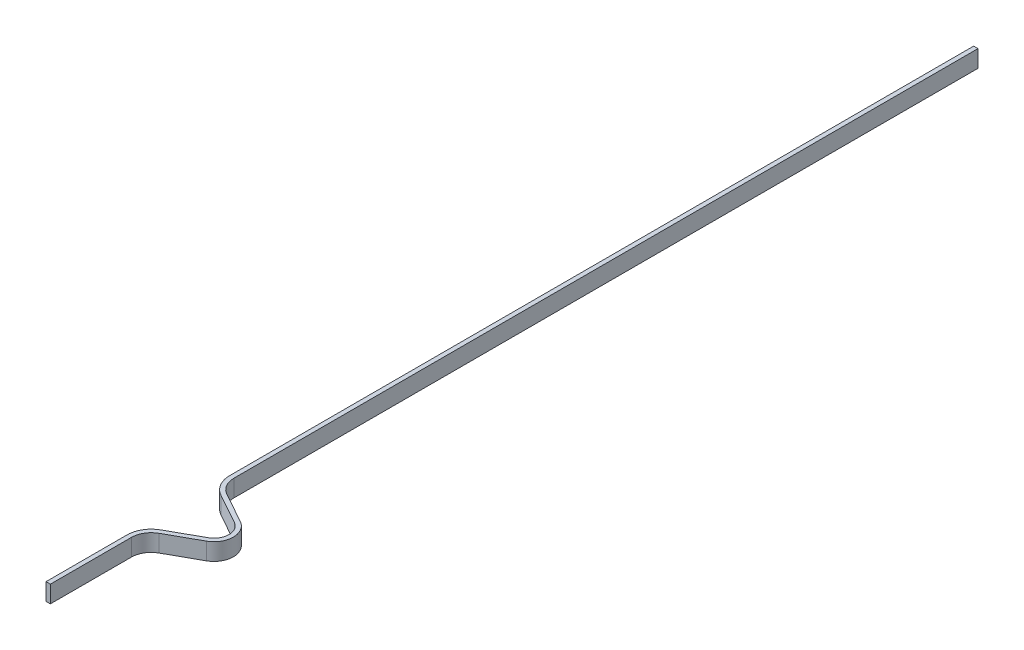
ISO-10303-21;
HEADER;
FILE_DESCRIPTION(('STEP AP214'),'2;1');
FILE_NAME('part.step','',(''),(''),'','','');
FILE_SCHEMA(('AUTOMOTIVE_DESIGN { 1 0 10303 214 1 1 1 1 }'));
ENDSEC;
DATA;
#1=APPLICATION_CONTEXT('core data for automotive mechanical design processes');
#2=APPLICATION_PROTOCOL_DEFINITION('international standard','automotive_design',2000,#1);
#3=PRODUCT_CONTEXT('',#1,'mechanical');
#4=PRODUCT('Part','Part','',(#3));
#5=PRODUCT_RELATED_PRODUCT_CATEGORY('part','',(#4));
#6=PRODUCT_DEFINITION_FORMATION('','',#4);
#7=PRODUCT_DEFINITION_CONTEXT('part definition',#1,'design');
#8=PRODUCT_DEFINITION('design','',#6,#7);
#9=PRODUCT_DEFINITION_SHAPE('','',#8);
#10=(LENGTH_UNIT() NAMED_UNIT(*) SI_UNIT(.MILLI.,.METRE.));
#11=(NAMED_UNIT(*) PLANE_ANGLE_UNIT() SI_UNIT($,.RADIAN.));
#12=(NAMED_UNIT(*) SI_UNIT($,.STERADIAN.) SOLID_ANGLE_UNIT());
#13=UNCERTAINTY_MEASURE_WITH_UNIT(LENGTH_MEASURE(1.E-05),#10,'distance_accuracy_value','');
#14=(GEOMETRIC_REPRESENTATION_CONTEXT(3) GLOBAL_UNCERTAINTY_ASSIGNED_CONTEXT((#13)) GLOBAL_UNIT_ASSIGNED_CONTEXT((#10,
#11,#12)) REPRESENTATION_CONTEXT('',''));
#15=CARTESIAN_POINT('',(0.,0.,0.));
#16=DIRECTION('',(0.,0.,1.));
#17=DIRECTION('',(1.,0.,0.));
#18=AXIS2_PLACEMENT_3D('',#15,#16,#17);
#19=CARTESIAN_POINT('',(-14.6552693793635,3.00000000000002,43.5054549480041));
#20=DIRECTION('',(1.,0.,0.));
#21=DIRECTION('',(0.,0.,-1.));
#22=AXIS2_PLACEMENT_3D('',#19,#20,#21);
#23=PLANE('',#22);
#24=DIRECTION('',(0.,0.,1.));
#25=VECTOR('',#24,1.);
#26=CARTESIAN_POINT('',(-14.6552693793635,-2.99999999999998,43.5054549480041));
#27=LINE('',#26,#25);
#28=CARTESIAN_POINT('',(-14.6552693793635,-2.99999999999998,43.5054549480041));
#29=VERTEX_POINT('',#28);
#30=CARTESIAN_POINT('',(-14.6552693793635,-2.99999999999998,71.8688694322497));
#31=VERTEX_POINT('',#30);
#32=EDGE_CURVE('E174',#29,#31,#27,.T.);
#33=ORIENTED_EDGE('',*,*,#32,.F.);
#34=DIRECTION('',(0.,-1.,0.));
#35=VECTOR('',#34,1.);
#36=CARTESIAN_POINT('',(-14.6552693793635,3.00000000000002,43.5054549480041));
#37=LINE('',#36,#35);
#38=CARTESIAN_POINT('',(-14.6552693793635,3.00000000000002,43.5054549480041));
#39=VERTEX_POINT('',#38);
#40=EDGE_CURVE('E11',#39,#29,#37,.T.);
#41=ORIENTED_EDGE('',*,*,#40,.F.);
#42=DIRECTION('',(0.,0.,1.));
#43=VECTOR('',#42,1.);
#44=CARTESIAN_POINT('',(-14.6552693793635,3.00000000000002,43.5054549480041));
#45=LINE('',#44,#43);
#46=CARTESIAN_POINT('',(-14.6552693793635,3.00000000000002,71.8688694322497));
#47=VERTEX_POINT('',#46);
#48=EDGE_CURVE('E210',#39,#47,#45,.T.);
#49=ORIENTED_EDGE('',*,*,#48,.T.);
#50=DIRECTION('',(0.,-1.,0.));
#51=VECTOR('',#50,1.);
#52=CARTESIAN_POINT('',(-14.6552693793635,3.00000000000002,71.8688694322497));
#53=LINE('',#52,#51);
#54=EDGE_CURVE('E33',#47,#31,#53,.T.);
#55=ORIENTED_EDGE('',*,*,#54,.T.);
#56=EDGE_LOOP('',(#33,#41,#49,#55));
#57=FACE_BOUND('',#56,.T.);
#58=ADVANCED_FACE('F30',(#57),#23,.T.);
#59=CARTESIAN_POINT('',(-7.65526937936355,3.00000000000002,43.5054549480041));
#60=DIRECTION('',(0.,-1.,0.));
#61=DIRECTION('',(0.,0.,-1.));
#62=AXIS2_PLACEMENT_3D('',#59,#60,#61);
#63=CYLINDRICAL_SURFACE('',#62,7.);
#64=CARTESIAN_POINT('',(-7.65526937936355,-2.99999999999998,43.5054549480041));
#65=DIRECTION('',(0.,1.,0.));
#66=DIRECTION('',(0.,0.,-1.));
#67=AXIS2_PLACEMENT_3D('',#64,#65,#66);
#68=CIRCLE('',#67,7.);
#69=CARTESIAN_POINT('',(-11.0583977103424,-2.99999999999998,37.3883708744533));
#70=VERTEX_POINT('',#69);
#71=EDGE_CURVE('E208',#70,#29,#68,.T.);
#72=ORIENTED_EDGE('',*,*,#71,.F.);
#73=DIRECTION('',(0.,-1.,0.));
#74=VECTOR('',#73,1.);
#75=CARTESIAN_POINT('',(-11.0583977103424,3.00000000000002,37.3883708744533));
#76=LINE('',#75,#74);
#77=CARTESIAN_POINT('',(-11.0583977103424,3.00000000000002,37.3883708744533));
#78=VERTEX_POINT('',#77);
#79=EDGE_CURVE('E39',#78,#70,#76,.T.);
#80=ORIENTED_EDGE('',*,*,#79,.F.);
#81=CARTESIAN_POINT('',(-7.65526937936355,3.00000000000002,43.5054549480041));
#82=DIRECTION('',(0.,1.,0.));
#83=DIRECTION('',(0.,0.,-1.));
#84=AXIS2_PLACEMENT_3D('',#81,#82,#83);
#85=CIRCLE('',#84,7.);
#86=EDGE_CURVE('E164',#78,#39,#85,.T.);
#87=ORIENTED_EDGE('',*,*,#86,.T.);
#88=ORIENTED_EDGE('',*,*,#40,.T.);
#89=EDGE_LOOP('',(#72,#80,#87,#88));
#90=FACE_BOUND('',#89,.T.);
#91=ADVANCED_FACE('F249',(#90),#63,.F.);
#92=CARTESIAN_POINT('',(-11.0583977103424,3.00000000000002,37.3883708744533));
#93=DIRECTION('',(0.486161190139841,0.,0.8738691533644));
#94=DIRECTION('',(0.8738691533644,0.,-0.486161190139841));
#95=AXIS2_PLACEMENT_3D('',#92,#93,#94);
#96=PLANE('',#95);
#97=DIRECTION('',(-0.8738691533644,0.,0.486161190139841));
#98=VECTOR('',#97,1.);
#99=CARTESIAN_POINT('',(-11.0583977103424,-2.99999999999998,37.3883708744533));
#100=LINE('',#99,#98);
#101=CARTESIAN_POINT('',(-0.356665704264732,-2.99999999999998,31.4346571535814));
#102=VERTEX_POINT('',#101);
#103=EDGE_CURVE('E152',#102,#70,#100,.T.);
#104=ORIENTED_EDGE('',*,*,#103,.F.);
#105=DIRECTION('',(0.,-1.,0.));
#106=VECTOR('',#105,1.);
#107=CARTESIAN_POINT('',(-0.356665704264732,3.00000000000002,31.4346571535814));
#108=LINE('',#107,#106);
#109=CARTESIAN_POINT('',(-0.356665704264732,3.00000000000002,31.4346571535814));
#110=VERTEX_POINT('',#109);
#111=EDGE_CURVE('E147',#110,#102,#108,.T.);
#112=ORIENTED_EDGE('',*,*,#111,.F.);
#113=DIRECTION('',(-0.8738691533644,0.,0.486161190139841));
#114=VECTOR('',#113,1.);
#115=CARTESIAN_POINT('',(-11.0583977103424,3.00000000000002,37.3883708744533));
#116=LINE('',#115,#114);
#117=EDGE_CURVE('E150',#110,#78,#116,.T.);
#118=ORIENTED_EDGE('',*,*,#117,.T.);
#119=ORIENTED_EDGE('',*,*,#79,.T.);
#120=EDGE_LOOP('',(#104,#112,#118,#119));
#121=FACE_BOUND('',#120,.T.);
#122=ADVANCED_FACE('F149',(#121),#96,.T.);
#123=CARTESIAN_POINT('',(-3.65526937936355,3.00000000000002,25.5054549480039));
#124=DIRECTION('',(0.,-1.,0.));
#125=DIRECTION('',(0.,0.,-1.));
#126=AXIS2_PLACEMENT_3D('',#123,#124,#125);
#127=CYLINDRICAL_SURFACE('',#126,6.785);
#128=CARTESIAN_POINT('',(-3.65526937936355,-2.99999999999998,25.5054549480039));
#129=DIRECTION('',(0.,-1.,0.));
#130=DIRECTION('',(0.,0.,-1.));
#131=AXIS2_PLACEMENT_3D('',#128,#129,#130);
#132=CIRCLE('',#131,6.785);
#133=CARTESIAN_POINT('',(-0.356665704264889,-2.99999999999998,19.5762527424264));
#134=VERTEX_POINT('',#133);
#135=EDGE_CURVE('E205',#134,#102,#132,.T.);
#136=ORIENTED_EDGE('',*,*,#135,.F.);
#137=DIRECTION('',(0.,-1.,0.));
#138=VECTOR('',#137,1.);
#139=CARTESIAN_POINT('',(-0.356665704264889,3.00000000000002,19.5762527424264));
#140=LINE('',#139,#138);
#141=CARTESIAN_POINT('',(-0.356665704264889,3.00000000000002,19.5762527424264));
#142=VERTEX_POINT('',#141);
#143=EDGE_CURVE('E157',#142,#134,#140,.T.);
#144=ORIENTED_EDGE('',*,*,#143,.F.);
#145=CARTESIAN_POINT('',(-3.65526937936355,3.00000000000002,25.5054549480039));
#146=DIRECTION('',(0.,-1.,0.));
#147=DIRECTION('',(0.,0.,-1.));
#148=AXIS2_PLACEMENT_3D('',#145,#146,#147);
#149=CIRCLE('',#148,6.785);
#150=EDGE_CURVE('E162',#142,#110,#149,.T.);
#151=ORIENTED_EDGE('',*,*,#150,.T.);
#152=ORIENTED_EDGE('',*,*,#111,.T.);
#153=EDGE_LOOP('',(#136,#144,#151,#152));
#154=FACE_BOUND('',#153,.T.);
#155=ADVANCED_FACE('F166',(#154),#127,.T.);
#156=CARTESIAN_POINT('',(-0.356665704264885,3.00000000000002,19.5762527424264));
#157=DIRECTION('',(0.486161190139817,0.,-0.873869153364413));
#158=DIRECTION('',(-0.873869153364414,0.,-0.486161190139817));
#159=AXIS2_PLACEMENT_3D('',#156,#157,#158);
#160=PLANE('',#159);
#161=DIRECTION('',(0.873869153364414,0.,0.486161190139817));
#162=VECTOR('',#161,1.);
#163=CARTESIAN_POINT('',(-0.356665704264885,-2.99999999999998,19.5762527424264));
#164=LINE('',#163,#162);
#165=CARTESIAN_POINT('',(-11.0583977103423,-2.99999999999998,13.622539021555));
#166=VERTEX_POINT('',#165);
#167=EDGE_CURVE('E202',#166,#134,#164,.T.);
#168=ORIENTED_EDGE('',*,*,#167,.F.);
#169=DIRECTION('',(0.,-1.,0.));
#170=VECTOR('',#169,1.);
#171=CARTESIAN_POINT('',(-11.0583977103423,3.00000000000002,13.622539021555));
#172=LINE('',#171,#170);
#173=CARTESIAN_POINT('',(-11.0583977103423,3.00000000000002,13.622539021555));
#174=VERTEX_POINT('',#173);
#175=EDGE_CURVE('E214',#174,#166,#172,.T.);
#176=ORIENTED_EDGE('',*,*,#175,.F.);
#177=DIRECTION('',(0.873869153364414,0.,0.486161190139817));
#178=VECTOR('',#177,1.);
#179=CARTESIAN_POINT('',(-0.356665704264885,3.00000000000002,19.5762527424264));
#180=LINE('',#179,#178);
#181=EDGE_CURVE('E167',#174,#142,#180,.T.);
#182=ORIENTED_EDGE('',*,*,#181,.T.);
#183=ORIENTED_EDGE('',*,*,#143,.T.);
#184=EDGE_LOOP('',(#168,#176,#182,#183));
#185=FACE_BOUND('',#184,.T.);
#186=ADVANCED_FACE('F262',(#185),#160,.T.);
#187=CARTESIAN_POINT('',(-7.65526937936355,3.00000000000002,7.50545494800413));
#188=DIRECTION('',(0.,-1.,0.));
#189=DIRECTION('',(0.,0.,-1.));
#190=AXIS2_PLACEMENT_3D('',#187,#188,#189);
#191=CYLINDRICAL_SURFACE('',#190,7.);
#192=CARTESIAN_POINT('',(-7.65526937936355,-2.99999999999998,7.50545494800413));
#193=DIRECTION('',(0.,1.,0.));
#194=DIRECTION('',(0.,0.,1.));
#195=AXIS2_PLACEMENT_3D('',#192,#193,#194);
#196=CIRCLE('',#195,7.);
#197=CARTESIAN_POINT('',(-14.6552693793635,-2.99999999999998,7.50545494800413));
#198=VERTEX_POINT('',#197);
#199=EDGE_CURVE('E199',#198,#166,#196,.T.);
#200=ORIENTED_EDGE('',*,*,#199,.F.);
#201=DIRECTION('',(0.,-1.,0.));
#202=VECTOR('',#201,1.);
#203=CARTESIAN_POINT('',(-14.6552693793635,3.00000000000002,7.50545494800413));
#204=LINE('',#203,#202);
#205=CARTESIAN_POINT('',(-14.6552693793635,3.00000000000002,7.50545494800413));
#206=VERTEX_POINT('',#205);
#207=EDGE_CURVE('E216',#206,#198,#204,.T.);
#208=ORIENTED_EDGE('',*,*,#207,.F.);
#209=CARTESIAN_POINT('',(-7.65526937936355,3.00000000000002,7.50545494800413));
#210=DIRECTION('',(0.,1.,0.));
#211=DIRECTION('',(0.,0.,1.));
#212=AXIS2_PLACEMENT_3D('',#209,#210,#211);
#213=CIRCLE('',#212,7.);
#214=EDGE_CURVE('E169',#206,#174,#213,.T.);
#215=ORIENTED_EDGE('',*,*,#214,.T.);
#216=ORIENTED_EDGE('',*,*,#175,.T.);
#217=EDGE_LOOP('',(#200,#208,#215,#216));
#218=FACE_BOUND('',#217,.T.);
#219=ADVANCED_FACE('F265',(#218),#191,.F.);
#220=CARTESIAN_POINT('',(-14.6552693793635,3.00000000000002,7.50545494800413));
#221=DIRECTION('',(1.,0.,0.));
#222=DIRECTION('',(0.,0.,-1.));
#223=AXIS2_PLACEMENT_3D('',#220,#221,#222);
#224=PLANE('',#223);
#225=DIRECTION('',(0.,0.,1.));
#226=VECTOR('',#225,1.);
#227=CARTESIAN_POINT('',(-14.6552693793635,-2.99999999999998,7.50545494800413));
#228=LINE('',#227,#226);
#229=CARTESIAN_POINT('',(-14.6552693793635,-2.99999999999998,-253.249467206225));
#230=VERTEX_POINT('',#229);
#231=EDGE_CURVE('E196',#230,#198,#228,.T.);
#232=ORIENTED_EDGE('',*,*,#231,.F.);
#233=DIRECTION('',(0.,-1.,0.));
#234=VECTOR('',#233,1.);
#235=CARTESIAN_POINT('',(-14.6552693793635,3.00000000000002,-253.249467206225));
#236=LINE('',#235,#234);
#237=CARTESIAN_POINT('',(-14.6552693793635,3.00000000000002,-253.249467206225));
#238=VERTEX_POINT('',#237);
#239=EDGE_CURVE('E218',#238,#230,#236,.T.);
#240=ORIENTED_EDGE('',*,*,#239,.F.);
#241=DIRECTION('',(0.,0.,1.));
#242=VECTOR('',#241,1.);
#243=CARTESIAN_POINT('',(-14.6552693793635,3.00000000000002,7.50545494800413));
#244=LINE('',#243,#242);
#245=EDGE_CURVE('E446',#238,#206,#244,.T.);
#246=ORIENTED_EDGE('',*,*,#245,.T.);
#247=ORIENTED_EDGE('',*,*,#207,.T.);
#248=EDGE_LOOP('',(#232,#240,#246,#247));
#249=FACE_BOUND('',#248,.T.);
#250=ADVANCED_FACE('F269',(#249),#224,.T.);
#251=CARTESIAN_POINT('',(-14.6552693793635,3.00000000000002,-253.249467206225));
#252=DIRECTION('',(0.,0.,1.));
#253=DIRECTION('',(1.,0.,0.));
#254=AXIS2_PLACEMENT_3D('',#251,#252,#253);
#255=PLANE('',#254);
#256=DIRECTION('',(-1.,0.,0.));
#257=VECTOR('',#256,1.);
#258=CARTESIAN_POINT('',(-14.6552693793635,-2.99999999999998,-253.249467206225));
#259=LINE('',#258,#257);
#260=CARTESIAN_POINT('',(-16.1752693793635,-2.99999999999998,-253.249467206225));
#261=VERTEX_POINT('',#260);
#262=EDGE_CURVE('E194',#230,#261,#259,.T.);
#263=ORIENTED_EDGE('',*,*,#262,.T.);
#264=DIRECTION('',(0.,-1.,0.));
#265=VECTOR('',#264,1.);
#266=CARTESIAN_POINT('',(-16.1752693793635,3.00000000000002,-253.249467206225));
#267=LINE('',#266,#265);
#268=CARTESIAN_POINT('',(-16.1752693793635,3.00000000000002,-253.249467206225));
#269=VERTEX_POINT('',#268);
#270=EDGE_CURVE('E220',#269,#261,#267,.T.);
#271=ORIENTED_EDGE('',*,*,#270,.F.);
#272=DIRECTION('',(-1.,0.,0.));
#273=VECTOR('',#272,1.);
#274=CARTESIAN_POINT('',(-14.6552693793635,3.00000000000002,-253.249467206225));
#275=LINE('',#274,#273);
#276=EDGE_CURVE('E450',#238,#269,#275,.T.);
#277=ORIENTED_EDGE('',*,*,#276,.F.);
#278=ORIENTED_EDGE('',*,*,#239,.T.);
#279=EDGE_LOOP('',(#263,#271,#277,#278));
#280=FACE_BOUND('',#279,.T.);
#281=ADVANCED_FACE('F273',(#280),#255,.F.);
#282=CARTESIAN_POINT('',(-16.1752693793635,3.00000000000002,7.50545494800413));
#283=DIRECTION('',(1.,0.,0.));
#284=DIRECTION('',(0.,0.,-1.));
#285=AXIS2_PLACEMENT_3D('',#282,#283,#284);
#286=PLANE('',#285);
#287=DIRECTION('',(0.,0.,-1.));
#288=VECTOR('',#287,1.);
#289=CARTESIAN_POINT('',(-16.1752693793635,-2.99999999999998,7.50545494800413));
#290=LINE('',#289,#288);
#291=CARTESIAN_POINT('',(-16.1752693793635,-2.99999999999998,7.50545494800413));
#292=VERTEX_POINT('',#291);
#293=EDGE_CURVE('E192',#261,#292,#290,.F.);
#294=ORIENTED_EDGE('',*,*,#293,.T.);
#295=DIRECTION('',(0.,-1.,0.));
#296=VECTOR('',#295,1.);
#297=CARTESIAN_POINT('',(-16.1752693793635,3.00000000000002,7.50545494800413));
#298=LINE('',#297,#296);
#299=CARTESIAN_POINT('',(-16.1752693793635,3.00000000000002,7.50545494800413));
#300=VERTEX_POINT('',#299);
#301=EDGE_CURVE('E223',#300,#292,#298,.T.);
#302=ORIENTED_EDGE('',*,*,#301,.F.);
#303=DIRECTION('',(0.,0.,-1.));
#304=VECTOR('',#303,1.);
#305=CARTESIAN_POINT('',(-16.1752693793635,3.00000000000002,7.50545494800413));
#306=LINE('',#305,#304);
#307=EDGE_CURVE('E438',#269,#300,#306,.F.);
#308=ORIENTED_EDGE('',*,*,#307,.F.);
#309=ORIENTED_EDGE('',*,*,#270,.T.);
#310=EDGE_LOOP('',(#294,#302,#308,#309));
#311=FACE_BOUND('',#310,.T.);
#312=ADVANCED_FACE('F277',(#311),#286,.F.);
#313=CARTESIAN_POINT('',(-7.65526937936355,3.00000000000002,7.50545494800413));
#314=DIRECTION('',(0.,-1.,0.));
#315=DIRECTION('',(0.,0.,-1.));
#316=AXIS2_PLACEMENT_3D('',#313,#314,#315);
#317=CYLINDRICAL_SURFACE('',#316,8.52);
#318=CARTESIAN_POINT('',(-7.65526937936355,-2.99999999999998,7.50545494800413));
#319=DIRECTION('',(0.,-1.,0.));
#320=DIRECTION('',(-1.,0.,0.));
#321=AXIS2_PLACEMENT_3D('',#318,#319,#320);
#322=CIRCLE('',#321,8.52);
#323=CARTESIAN_POINT('',(-11.7973627193548,-2.99999999999998,14.9508201346689));
#324=VERTEX_POINT('',#323);
#325=EDGE_CURVE('E190',#292,#324,#322,.F.);
#326=ORIENTED_EDGE('',*,*,#325,.T.);
#327=DIRECTION('',(0.,-1.,0.));
#328=VECTOR('',#327,1.);
#329=CARTESIAN_POINT('',(-11.7973627193548,3.00000000000002,14.9508201346689));
#330=LINE('',#329,#328);
#331=CARTESIAN_POINT('',(-11.7973627193548,3.00000000000002,14.9508201346689));
#332=VERTEX_POINT('',#331);
#333=EDGE_CURVE('E226',#332,#324,#330,.T.);
#334=ORIENTED_EDGE('',*,*,#333,.F.);
#335=CARTESIAN_POINT('',(-7.65526937936355,3.00000000000002,7.50545494800413));
#336=DIRECTION('',(0.,-1.,0.));
#337=DIRECTION('',(-1.,0.,0.));
#338=AXIS2_PLACEMENT_3D('',#335,#336,#337);
#339=CIRCLE('',#338,8.52);
#340=EDGE_CURVE('E435',#300,#332,#339,.F.);
#341=ORIENTED_EDGE('',*,*,#340,.F.);
#342=ORIENTED_EDGE('',*,*,#301,.T.);
#343=EDGE_LOOP('',(#326,#334,#341,#342));
#344=FACE_BOUND('',#343,.T.);
#345=ADVANCED_FACE('F281',(#344),#317,.T.);
#346=CARTESIAN_POINT('',(-1.09563071327741,3.00000000000002,20.9045338555403));
#347=DIRECTION('',(0.486161190139817,0.,-0.873869153364413));
#348=DIRECTION('',(-0.873869153364414,0.,-0.486161190139817));
#349=AXIS2_PLACEMENT_3D('',#346,#347,#348);
#350=PLANE('',#349);
#351=DIRECTION('',(0.873869153364414,0.,0.486161190139817));
#352=VECTOR('',#351,1.);
#353=CARTESIAN_POINT('',(-1.09563071327741,-2.99999999999998,20.9045338555403));
#354=LINE('',#353,#352);
#355=CARTESIAN_POINT('',(-1.09563071327741,-2.99999999999998,20.9045338555403));
#356=VERTEX_POINT('',#355);
#357=EDGE_CURVE('E188',#324,#356,#354,.T.);
#358=ORIENTED_EDGE('',*,*,#357,.T.);
#359=DIRECTION('',(0.,-1.,0.));
#360=VECTOR('',#359,1.);
#361=CARTESIAN_POINT('',(-1.09563071327741,3.00000000000002,20.9045338555403));
#362=LINE('',#361,#360);
#363=CARTESIAN_POINT('',(-1.09563071327741,3.00000000000002,20.9045338555403));
#364=VERTEX_POINT('',#363);
#365=EDGE_CURVE('E229',#364,#356,#362,.T.);
#366=ORIENTED_EDGE('',*,*,#365,.F.);
#367=DIRECTION('',(0.873869153364414,0.,0.486161190139817));
#368=VECTOR('',#367,1.);
#369=CARTESIAN_POINT('',(-1.09563071327741,3.00000000000002,20.9045338555403));
#370=LINE('',#369,#368);
#371=EDGE_CURVE('E433',#332,#364,#370,.T.);
#372=ORIENTED_EDGE('',*,*,#371,.F.);
#373=ORIENTED_EDGE('',*,*,#333,.T.);
#374=EDGE_LOOP('',(#358,#366,#372,#373));
#375=FACE_BOUND('',#374,.T.);
#376=ADVANCED_FACE('F285',(#375),#350,.F.);
#377=CARTESIAN_POINT('',(-3.65526937936355,3.00000000000002,25.5054549480039));
#378=DIRECTION('',(0.,-1.,0.));
#379=DIRECTION('',(0.,0.,-1.));
#380=AXIS2_PLACEMENT_3D('',#377,#378,#379);
#381=CYLINDRICAL_SURFACE('',#380,5.265);
#382=CARTESIAN_POINT('',(-3.65526937936355,-2.99999999999998,25.5054549480039));
#383=DIRECTION('',(0.,-1.,0.));
#384=DIRECTION('',(-1.,0.,0.));
#385=AXIS2_PLACEMENT_3D('',#382,#383,#384);
#386=CIRCLE('',#385,5.265);
#387=CARTESIAN_POINT('',(-1.09563071327729,-2.99999999999998,30.1063760404675));
#388=VERTEX_POINT('',#387);
#389=EDGE_CURVE('E186',#356,#388,#386,.T.);
#390=ORIENTED_EDGE('',*,*,#389,.T.);
#391=DIRECTION('',(0.,-1.,0.));
#392=VECTOR('',#391,1.);
#393=CARTESIAN_POINT('',(-1.09563071327729,3.00000000000002,30.1063760404675));
#394=LINE('',#393,#392);
#395=CARTESIAN_POINT('',(-1.09563071327729,3.00000000000002,30.1063760404675));
#396=VERTEX_POINT('',#395);
#397=EDGE_CURVE('E232',#396,#388,#394,.T.);
#398=ORIENTED_EDGE('',*,*,#397,.F.);
#399=CARTESIAN_POINT('',(-3.65526937936355,3.00000000000002,25.5054549480039));
#400=DIRECTION('',(0.,-1.,0.));
#401=DIRECTION('',(-1.,0.,0.));
#402=AXIS2_PLACEMENT_3D('',#399,#400,#401);
#403=CIRCLE('',#402,5.265);
#404=EDGE_CURVE('E426',#364,#396,#403,.T.);
#405=ORIENTED_EDGE('',*,*,#404,.F.);
#406=ORIENTED_EDGE('',*,*,#365,.T.);
#407=EDGE_LOOP('',(#390,#398,#405,#406));
#408=FACE_BOUND('',#407,.T.);
#409=ADVANCED_FACE('F289',(#408),#381,.F.);
#410=CARTESIAN_POINT('',(-11.797362719355,3.00000000000002,36.0600897613394));
#411=DIRECTION('',(0.486161190139841,0.,0.8738691533644));
#412=DIRECTION('',(0.8738691533644,0.,-0.486161190139841));
#413=AXIS2_PLACEMENT_3D('',#410,#411,#412);
#414=PLANE('',#413);
#415=DIRECTION('',(-0.8738691533644,0.,0.486161190139841));
#416=VECTOR('',#415,1.);
#417=CARTESIAN_POINT('',(-11.797362719355,-2.99999999999998,36.0600897613394));
#418=LINE('',#417,#416);
#419=CARTESIAN_POINT('',(-11.797362719355,-2.99999999999998,36.0600897613394));
#420=VERTEX_POINT('',#419);
#421=EDGE_CURVE('E184',#388,#420,#418,.T.);
#422=ORIENTED_EDGE('',*,*,#421,.T.);
#423=DIRECTION('',(0.,-1.,0.));
#424=VECTOR('',#423,1.);
#425=CARTESIAN_POINT('',(-11.797362719355,3.00000000000002,36.0600897613394));
#426=LINE('',#425,#424);
#427=CARTESIAN_POINT('',(-11.797362719355,3.00000000000002,36.0600897613394));
#428=VERTEX_POINT('',#427);
#429=EDGE_CURVE('E235',#428,#420,#426,.T.);
#430=ORIENTED_EDGE('',*,*,#429,.F.);
#431=DIRECTION('',(-0.8738691533644,0.,0.486161190139841));
#432=VECTOR('',#431,1.);
#433=CARTESIAN_POINT('',(-11.797362719355,3.00000000000002,36.0600897613394));
#434=LINE('',#433,#432);
#435=EDGE_CURVE('E423',#396,#428,#434,.T.);
#436=ORIENTED_EDGE('',*,*,#435,.F.);
#437=ORIENTED_EDGE('',*,*,#397,.T.);
#438=EDGE_LOOP('',(#422,#430,#436,#437));
#439=FACE_BOUND('',#438,.T.);
#440=ADVANCED_FACE('F293',(#439),#414,.F.);
#441=CARTESIAN_POINT('',(-7.65526937936355,3.00000000000002,43.5054549480041));
#442=DIRECTION('',(0.,-1.,0.));
#443=DIRECTION('',(0.,0.,-1.));
#444=AXIS2_PLACEMENT_3D('',#441,#442,#443);
#445=CYLINDRICAL_SURFACE('',#444,8.52);
#446=CARTESIAN_POINT('',(-7.65526937936355,-2.99999999999998,43.5054549480041));
#447=DIRECTION('',(0.,-1.,0.));
#448=DIRECTION('',(-1.,0.,0.));
#449=AXIS2_PLACEMENT_3D('',#446,#447,#448);
#450=CIRCLE('',#449,8.52);
#451=CARTESIAN_POINT('',(-16.1752693793635,-2.99999999999998,43.5054549480041));
#452=VERTEX_POINT('',#451);
#453=EDGE_CURVE('E182',#420,#452,#450,.F.);
#454=ORIENTED_EDGE('',*,*,#453,.T.);
#455=DIRECTION('',(0.,-1.,0.));
#456=VECTOR('',#455,1.);
#457=CARTESIAN_POINT('',(-16.1752693793635,3.00000000000002,43.5054549480041));
#458=LINE('',#457,#456);
#459=CARTESIAN_POINT('',(-16.1752693793635,3.00000000000002,43.5054549480041));
#460=VERTEX_POINT('',#459);
#461=EDGE_CURVE('E238',#460,#452,#458,.T.);
#462=ORIENTED_EDGE('',*,*,#461,.F.);
#463=CARTESIAN_POINT('',(-7.65526937936355,3.00000000000002,43.5054549480041));
#464=DIRECTION('',(0.,-1.,0.));
#465=DIRECTION('',(-1.,0.,0.));
#466=AXIS2_PLACEMENT_3D('',#463,#464,#465);
#467=CIRCLE('',#466,8.52);
#468=EDGE_CURVE('E421',#428,#460,#467,.F.);
#469=ORIENTED_EDGE('',*,*,#468,.F.);
#470=ORIENTED_EDGE('',*,*,#429,.T.);
#471=EDGE_LOOP('',(#454,#462,#469,#470));
#472=FACE_BOUND('',#471,.T.);
#473=ADVANCED_FACE('F297',(#472),#445,.T.);
#474=CARTESIAN_POINT('',(-16.1752693793635,3.00000000000002,43.5054549480041));
#475=DIRECTION('',(1.,0.,0.));
#476=DIRECTION('',(0.,0.,-1.));
#477=AXIS2_PLACEMENT_3D('',#474,#475,#476);
#478=PLANE('',#477);
#479=DIRECTION('',(0.,0.,1.));
#480=VECTOR('',#479,1.);
#481=CARTESIAN_POINT('',(-16.1752693793635,-2.99999999999998,43.5054549480041));
#482=LINE('',#481,#480);
#483=CARTESIAN_POINT('',(-16.1752693793635,-2.99999999999998,71.8688694322497));
#484=VERTEX_POINT('',#483);
#485=EDGE_CURVE('E180',#452,#484,#482,.T.);
#486=ORIENTED_EDGE('',*,*,#485,.T.);
#487=DIRECTION('',(0.,-1.,0.));
#488=VECTOR('',#487,1.);
#489=CARTESIAN_POINT('',(-16.1752693793635,3.00000000000002,71.8688694322497));
#490=LINE('',#489,#488);
#491=CARTESIAN_POINT('',(-16.1752693793635,3.00000000000002,71.8688694322497));
#492=VERTEX_POINT('',#491);
#493=EDGE_CURVE('E240',#492,#484,#490,.T.);
#494=ORIENTED_EDGE('',*,*,#493,.F.);
#495=DIRECTION('',(0.,0.,1.));
#496=VECTOR('',#495,1.);
#497=CARTESIAN_POINT('',(-16.1752693793635,3.00000000000002,43.5054549480041));
#498=LINE('',#497,#496);
#499=EDGE_CURVE('E460',#460,#492,#498,.T.);
#500=ORIENTED_EDGE('',*,*,#499,.F.);
#501=ORIENTED_EDGE('',*,*,#461,.T.);
#502=EDGE_LOOP('',(#486,#494,#500,#501));
#503=FACE_BOUND('',#502,.T.);
#504=ADVANCED_FACE('F301',(#503),#478,.F.);
#505=CARTESIAN_POINT('',(-16.1752693793635,3.00000000000002,71.8688694322497));
#506=DIRECTION('',(0.,0.,-1.));
#507=DIRECTION('',(-1.,0.,0.));
#508=AXIS2_PLACEMENT_3D('',#505,#506,#507);
#509=PLANE('',#508);
#510=DIRECTION('',(1.,0.,0.));
#511=VECTOR('',#510,1.);
#512=CARTESIAN_POINT('',(-16.1752693793635,-2.99999999999998,71.8688694322497));
#513=LINE('',#512,#511);
#514=EDGE_CURVE('E177',#484,#31,#513,.T.);
#515=ORIENTED_EDGE('',*,*,#514,.T.);
#516=ORIENTED_EDGE('',*,*,#54,.F.);
#517=DIRECTION('',(1.,0.,0.));
#518=VECTOR('',#517,1.);
#519=CARTESIAN_POINT('',(-16.1752693793635,3.00000000000002,71.8688694322497));
#520=LINE('',#519,#518);
#521=EDGE_CURVE('E110',#492,#47,#520,.T.);
#522=ORIENTED_EDGE('',*,*,#521,.F.);
#523=ORIENTED_EDGE('',*,*,#493,.T.);
#524=EDGE_LOOP('',(#515,#516,#522,#523));
#525=FACE_BOUND('',#524,.T.);
#526=ADVANCED_FACE('F245',(#525),#509,.F.);
#527=CARTESIAN_POINT('',(-7.65526937936355,3.00000000000002,43.5054549480041));
#528=DIRECTION('',(0.,-1.,0.));
#529=DIRECTION('',(0.,0.,-1.));
#530=AXIS2_PLACEMENT_3D('',#527,#528,#529);
#531=PLANE('',#530);
#532=ORIENTED_EDGE('',*,*,#48,.F.);
#533=ORIENTED_EDGE('',*,*,#86,.F.);
#534=ORIENTED_EDGE('',*,*,#117,.F.);
#535=ORIENTED_EDGE('',*,*,#150,.F.);
#536=ORIENTED_EDGE('',*,*,#181,.F.);
#537=ORIENTED_EDGE('',*,*,#214,.F.);
#538=ORIENTED_EDGE('',*,*,#245,.F.);
#539=ORIENTED_EDGE('',*,*,#276,.T.);
#540=ORIENTED_EDGE('',*,*,#307,.T.);
#541=ORIENTED_EDGE('',*,*,#340,.T.);
#542=ORIENTED_EDGE('',*,*,#371,.T.);
#543=ORIENTED_EDGE('',*,*,#404,.T.);
#544=ORIENTED_EDGE('',*,*,#435,.T.);
#545=ORIENTED_EDGE('',*,*,#468,.T.);
#546=ORIENTED_EDGE('',*,*,#499,.T.);
#547=ORIENTED_EDGE('',*,*,#521,.T.);
#548=EDGE_LOOP('',(#532,#533,#534,#535,#536,#537,#538,#539,#540,#541,#542,#543,#544,#545,#546,#547));
#549=FACE_BOUND('',#548,.T.);
#550=ADVANCED_FACE('F160',(#549),#531,.F.);
#551=CARTESIAN_POINT('',(-7.65526937936355,-2.99999999999998,43.5054549480041));
#552=DIRECTION('',(0.,-1.,0.));
#553=DIRECTION('',(0.,0.,-1.));
#554=AXIS2_PLACEMENT_3D('',#551,#552,#553);
#555=PLANE('',#554);
#556=ORIENTED_EDGE('',*,*,#32,.T.);
#557=ORIENTED_EDGE('',*,*,#514,.F.);
#558=ORIENTED_EDGE('',*,*,#485,.F.);
#559=ORIENTED_EDGE('',*,*,#453,.F.);
#560=ORIENTED_EDGE('',*,*,#421,.F.);
#561=ORIENTED_EDGE('',*,*,#389,.F.);
#562=ORIENTED_EDGE('',*,*,#357,.F.);
#563=ORIENTED_EDGE('',*,*,#325,.F.);
#564=ORIENTED_EDGE('',*,*,#293,.F.);
#565=ORIENTED_EDGE('',*,*,#262,.F.);
#566=ORIENTED_EDGE('',*,*,#231,.T.);
#567=ORIENTED_EDGE('',*,*,#199,.T.);
#568=ORIENTED_EDGE('',*,*,#167,.T.);
#569=ORIENTED_EDGE('',*,*,#135,.T.);
#570=ORIENTED_EDGE('',*,*,#103,.T.);
#571=ORIENTED_EDGE('',*,*,#71,.T.);
#572=EDGE_LOOP('',(#556,#557,#558,#559,#560,#561,#562,#563,#564,#565,#566,#567,#568,#569,#570,#571));
#573=FACE_BOUND('',#572,.T.);
#574=ADVANCED_FACE('F248',(#573),#555,.T.);
#575=CLOSED_SHELL('',(#58,#91,#122,#155,#186,#219,#250,#281,#312,#345,#376,#409,#440,#473,#504,
#526,#550,#574));
#576=MANIFOLD_SOLID_BREP('B2',#575);
#577=ADVANCED_BREP_SHAPE_REPRESENTATION('',(#18,#576),#14);
#578=SHAPE_DEFINITION_REPRESENTATION(#9,#577);
ENDSEC;
END-ISO-10303-21;
